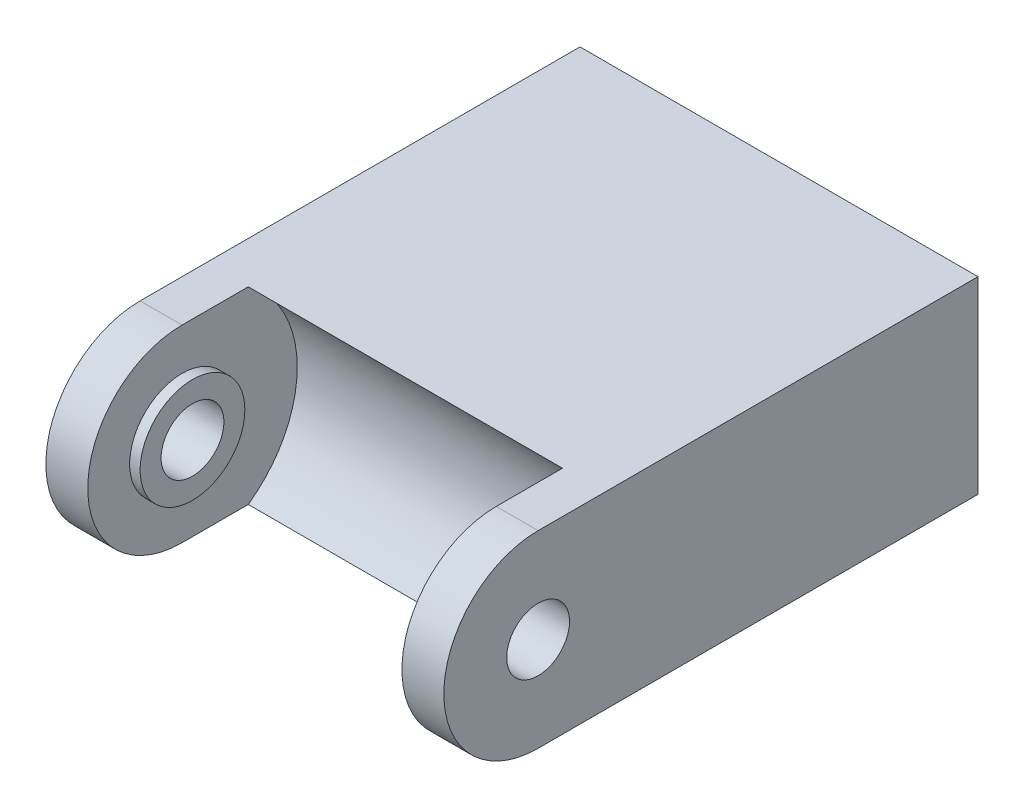
ISO-10303-21;
HEADER;
FILE_DESCRIPTION(('STEP AP214'),'2;1');
FILE_NAME('part.step','',(''),(''),'','','');
FILE_SCHEMA(('AUTOMOTIVE_DESIGN { 1 0 10303 214 1 1 1 1 }'));
ENDSEC;
DATA;
#1=APPLICATION_CONTEXT('core data for automotive mechanical design processes');
#2=APPLICATION_PROTOCOL_DEFINITION('international standard','automotive_design',2000,#1);
#3=PRODUCT_CONTEXT('',#1,'mechanical');
#4=PRODUCT('Part','Part','',(#3));
#5=PRODUCT_RELATED_PRODUCT_CATEGORY('part','',(#4));
#6=PRODUCT_DEFINITION_FORMATION('','',#4);
#7=PRODUCT_DEFINITION_CONTEXT('part definition',#1,'design');
#8=PRODUCT_DEFINITION('design','',#6,#7);
#9=PRODUCT_DEFINITION_SHAPE('','',#8);
#10=(LENGTH_UNIT() NAMED_UNIT(*) SI_UNIT(.MILLI.,.METRE.));
#11=(NAMED_UNIT(*) PLANE_ANGLE_UNIT() SI_UNIT($,.RADIAN.));
#12=(NAMED_UNIT(*) SI_UNIT($,.STERADIAN.) SOLID_ANGLE_UNIT());
#13=UNCERTAINTY_MEASURE_WITH_UNIT(LENGTH_MEASURE(1.E-05),#10,'distance_accuracy_value','');
#14=(GEOMETRIC_REPRESENTATION_CONTEXT(3) GLOBAL_UNCERTAINTY_ASSIGNED_CONTEXT((#13)) GLOBAL_UNIT_ASSIGNED_CONTEXT((#10,
#11,#12)) REPRESENTATION_CONTEXT('',''));
#15=CARTESIAN_POINT('',(0.,0.,0.));
#16=DIRECTION('',(0.,0.,1.));
#17=DIRECTION('',(1.,0.,0.));
#18=AXIS2_PLACEMENT_3D('',#15,#16,#17);
#19=CARTESIAN_POINT('',(-9.5,0.,0.));
#20=DIRECTION('',(1.,0.,0.));
#21=DIRECTION('',(0.,0.,-1.));
#22=AXIS2_PLACEMENT_3D('',#19,#20,#21);
#23=CYLINDRICAL_SURFACE('',#22,4.5);
#24=DIRECTION('',(1.,0.,0.));
#25=VECTOR('',#24,1.);
#26=CARTESIAN_POINT('',(-9.5,-4.5,0.));
#27=LINE('',#26,#25);
#28=CARTESIAN_POINT('',(-9.5,-4.5,0.));
#29=VERTEX_POINT('',#28);
#30=CARTESIAN_POINT('',(-7.5,-4.5,0.));
#31=VERTEX_POINT('',#30);
#32=EDGE_CURVE('E171',#29,#31,#27,.T.);
#33=ORIENTED_EDGE('',*,*,#32,.T.);
#34=CARTESIAN_POINT('',(-7.5,0.,0.));
#35=DIRECTION('',(1.,0.,0.));
#36=DIRECTION('',(0.,0.,-1.));
#37=AXIS2_PLACEMENT_3D('',#34,#35,#36);
#38=CIRCLE('',#37,4.5);
#39=CARTESIAN_POINT('',(-7.5,4.5,0.));
#40=VERTEX_POINT('',#39);
#41=EDGE_CURVE('E116',#31,#40,#38,.F.);
#42=ORIENTED_EDGE('',*,*,#41,.T.);
#43=DIRECTION('',(1.,0.,0.));
#44=VECTOR('',#43,1.);
#45=CARTESIAN_POINT('',(-9.5,4.5,0.));
#46=LINE('',#45,#44);
#47=CARTESIAN_POINT('',(-9.5,4.5,0.));
#48=VERTEX_POINT('',#47);
#49=EDGE_CURVE('E175',#48,#40,#46,.T.);
#50=ORIENTED_EDGE('',*,*,#49,.F.);
#51=CARTESIAN_POINT('',(-9.5,0.,0.));
#52=DIRECTION('',(1.,0.,0.));
#53=DIRECTION('',(0.,0.,-1.));
#54=AXIS2_PLACEMENT_3D('',#51,#52,#53);
#55=CIRCLE('',#54,4.5);
#56=EDGE_CURVE('E160',#48,#29,#55,.T.);
#57=ORIENTED_EDGE('',*,*,#56,.T.);
#58=EDGE_LOOP('',(#33,#42,#50,#57));
#59=FACE_BOUND('',#58,.T.);
#60=ADVANCED_FACE('F35',(#59),#23,.T.);
#61=CARTESIAN_POINT('',(-9.5,4.5,0.));
#62=DIRECTION('',(0.,-1.,0.));
#63=DIRECTION('',(0.,0.,-1.));
#64=AXIS2_PLACEMENT_3D('',#61,#62,#63);
#65=PLANE('',#64);
#66=DIRECTION('',(-1.,0.,0.));
#67=VECTOR('',#66,1.);
#68=CARTESIAN_POINT('',(7.,4.5,-3.16227766016838));
#69=LINE('',#68,#67);
#70=CARTESIAN_POINT('',(7.5,4.5,-3.16227766016838));
#71=VERTEX_POINT('',#70);
#72=CARTESIAN_POINT('',(-7.5,4.5,-3.16227766016838));
#73=VERTEX_POINT('',#72);
#74=EDGE_CURVE('E97',#71,#73,#69,.T.);
#75=ORIENTED_EDGE('',*,*,#74,.F.);
#76=DIRECTION('',(0.,0.,1.));
#77=VECTOR('',#76,1.);
#78=CARTESIAN_POINT('',(7.5,4.5,0.));
#79=LINE('',#78,#77);
#80=CARTESIAN_POINT('',(7.5,4.5,0.));
#81=VERTEX_POINT('',#80);
#82=EDGE_CURVE('E99',#71,#81,#79,.T.);
#83=ORIENTED_EDGE('',*,*,#82,.T.);
#84=CARTESIAN_POINT('',(9.5,4.5,0.));
#85=VERTEX_POINT('',#84);
#86=EDGE_CURVE('E166',#81,#85,#46,.T.);
#87=ORIENTED_EDGE('',*,*,#86,.T.);
#88=DIRECTION('',(0.,0.,-1.));
#89=VECTOR('',#88,1.);
#90=CARTESIAN_POINT('',(9.5,4.5,0.));
#91=LINE('',#90,#89);
#92=CARTESIAN_POINT('',(9.5,4.5,-21.));
#93=VERTEX_POINT('',#92);
#94=EDGE_CURVE('E107',#85,#93,#91,.T.);
#95=ORIENTED_EDGE('',*,*,#94,.T.);
#96=DIRECTION('',(1.,0.,0.));
#97=VECTOR('',#96,1.);
#98=CARTESIAN_POINT('',(-9.5,4.5,-21.));
#99=LINE('',#98,#97);
#100=CARTESIAN_POINT('',(-9.5,4.5,-21.));
#101=VERTEX_POINT('',#100);
#102=EDGE_CURVE('E167',#101,#93,#99,.T.);
#103=ORIENTED_EDGE('',*,*,#102,.F.);
#104=DIRECTION('',(0.,0.,-1.));
#105=VECTOR('',#104,1.);
#106=CARTESIAN_POINT('',(-9.5,4.5,0.));
#107=LINE('',#106,#105);
#108=EDGE_CURVE('E158',#48,#101,#107,.T.);
#109=ORIENTED_EDGE('',*,*,#108,.F.);
#110=ORIENTED_EDGE('',*,*,#49,.T.);
#111=DIRECTION('',(0.,0.,1.));
#112=VECTOR('',#111,1.);
#113=CARTESIAN_POINT('',(-7.5,4.5,0.));
#114=LINE('',#113,#112);
#115=EDGE_CURVE('E102',#73,#40,#114,.T.);
#116=ORIENTED_EDGE('',*,*,#115,.F.);
#117=EDGE_LOOP('',(#75,#83,#87,#95,#103,#109,#110,#116));
#118=FACE_BOUND('',#117,.T.);
#119=ADVANCED_FACE('F37',(#118),#65,.F.);
#120=CARTESIAN_POINT('',(-9.5,-4.5,0.));
#121=DIRECTION('',(0.,1.,0.));
#122=DIRECTION('',(0.,0.,1.));
#123=AXIS2_PLACEMENT_3D('',#120,#121,#122);
#124=PLANE('',#123);
#125=CARTESIAN_POINT('',(7.5,-4.5,0.));
#126=VERTEX_POINT('',#125);
#127=CARTESIAN_POINT('',(9.5,-4.5,0.));
#128=VERTEX_POINT('',#127);
#129=EDGE_CURVE('E174',#126,#128,#27,.T.);
#130=ORIENTED_EDGE('',*,*,#129,.F.);
#131=DIRECTION('',(0.,0.,-1.));
#132=VECTOR('',#131,1.);
#133=CARTESIAN_POINT('',(7.5,-4.5,0.));
#134=LINE('',#133,#132);
#135=CARTESIAN_POINT('',(7.5,-4.5,-3.16227766016838));
#136=VERTEX_POINT('',#135);
#137=EDGE_CURVE('E117',#126,#136,#134,.T.);
#138=ORIENTED_EDGE('',*,*,#137,.T.);
#139=DIRECTION('',(-1.,0.,0.));
#140=VECTOR('',#139,1.);
#141=CARTESIAN_POINT('',(7.,-4.5,-3.16227766016838));
#142=LINE('',#141,#140);
#143=CARTESIAN_POINT('',(-7.5,-4.5,-3.16227766016838));
#144=VERTEX_POINT('',#143);
#145=EDGE_CURVE('E120',#144,#136,#142,.F.);
#146=ORIENTED_EDGE('',*,*,#145,.F.);
#147=DIRECTION('',(0.,0.,-1.));
#148=VECTOR('',#147,1.);
#149=CARTESIAN_POINT('',(-7.5,-4.5,0.));
#150=LINE('',#149,#148);
#151=EDGE_CURVE('E11',#31,#144,#150,.T.);
#152=ORIENTED_EDGE('',*,*,#151,.F.);
#153=ORIENTED_EDGE('',*,*,#32,.F.);
#154=DIRECTION('',(0.,0.,1.));
#155=VECTOR('',#154,1.);
#156=CARTESIAN_POINT('',(-9.5,-4.5,0.));
#157=LINE('',#156,#155);
#158=CARTESIAN_POINT('',(-9.5,-4.5,-21.));
#159=VERTEX_POINT('',#158);
#160=EDGE_CURVE('E163',#159,#29,#157,.T.);
#161=ORIENTED_EDGE('',*,*,#160,.F.);
#162=DIRECTION('',(1.,0.,0.));
#163=VECTOR('',#162,1.);
#164=CARTESIAN_POINT('',(-9.5,-4.5,-21.));
#165=LINE('',#164,#163);
#166=CARTESIAN_POINT('',(9.5,-4.5,-21.));
#167=VERTEX_POINT('',#166);
#168=EDGE_CURVE('E169',#159,#167,#165,.T.);
#169=ORIENTED_EDGE('',*,*,#168,.T.);
#170=DIRECTION('',(0.,0.,1.));
#171=VECTOR('',#170,1.);
#172=CARTESIAN_POINT('',(9.5,-4.5,0.));
#173=LINE('',#172,#171);
#174=EDGE_CURVE('E152',#167,#128,#173,.T.);
#175=ORIENTED_EDGE('',*,*,#174,.T.);
#176=EDGE_LOOP('',(#130,#138,#146,#152,#153,#161,#169,#175));
#177=FACE_BOUND('',#176,.T.);
#178=ADVANCED_FACE('F227',(#177),#124,.F.);
#179=CARTESIAN_POINT('',(7.,0.,0.));
#180=DIRECTION('',(1.,0.,0.));
#181=DIRECTION('',(0.,0.,-1.));
#182=AXIS2_PLACEMENT_3D('',#179,#180,#181);
#183=PLANE('',#182);
#184=CARTESIAN_POINT('',(7.,0.,0.));
#185=DIRECTION('',(1.,0.,0.));
#186=DIRECTION('',(0.,0.,-1.));
#187=AXIS2_PLACEMENT_3D('',#184,#185,#186);
#188=CIRCLE('',#187,1.5);
#189=CARTESIAN_POINT('',(7.,0.,-1.5));
#190=VERTEX_POINT('',#189);
#191=EDGE_CURVE('E108',#190,#190,#188,.T.);
#192=ORIENTED_EDGE('',*,*,#191,.T.);
#193=EDGE_LOOP('',(#192));
#194=FACE_BOUND('',#193,.T.);
#195=CARTESIAN_POINT('',(7.,0.,0.));
#196=DIRECTION('',(1.,0.,0.));
#197=DIRECTION('',(0.,0.,-1.));
#198=AXIS2_PLACEMENT_3D('',#195,#196,#197);
#199=CIRCLE('',#198,2.5);
#200=CARTESIAN_POINT('',(7.,0.,-2.5));
#201=VERTEX_POINT('',#200);
#202=EDGE_CURVE('E125',#201,#201,#199,.F.);
#203=ORIENTED_EDGE('',*,*,#202,.T.);
#204=EDGE_LOOP('',(#203));
#205=FACE_BOUND('',#204,.T.);
#206=ADVANCED_FACE('F188',(#194,#205),#183,.F.);
#207=CARTESIAN_POINT('',(-7.,0.,0.));
#208=DIRECTION('',(1.,0.,0.));
#209=DIRECTION('',(0.,0.,-1.));
#210=AXIS2_PLACEMENT_3D('',#207,#208,#209);
#211=PLANE('',#210);
#212=CARTESIAN_POINT('',(-7.,0.,0.));
#213=DIRECTION('',(1.,0.,0.));
#214=DIRECTION('',(0.,0.,-1.));
#215=AXIS2_PLACEMENT_3D('',#212,#213,#214);
#216=CIRCLE('',#215,1.5);
#217=CARTESIAN_POINT('',(-7.,0.,-1.5));
#218=VERTEX_POINT('',#217);
#219=EDGE_CURVE('E144',#218,#218,#216,.T.);
#220=ORIENTED_EDGE('',*,*,#219,.F.);
#221=EDGE_LOOP('',(#220));
#222=FACE_BOUND('',#221,.T.);
#223=CARTESIAN_POINT('',(-7.,0.,0.));
#224=DIRECTION('',(1.,0.,0.));
#225=DIRECTION('',(0.,0.,-1.));
#226=AXIS2_PLACEMENT_3D('',#223,#224,#225);
#227=CIRCLE('',#226,2.5);
#228=CARTESIAN_POINT('',(-7.,0.,-2.5));
#229=VERTEX_POINT('',#228);
#230=EDGE_CURVE('E121',#229,#229,#227,.F.);
#231=ORIENTED_EDGE('',*,*,#230,.F.);
#232=EDGE_LOOP('',(#231));
#233=FACE_BOUND('',#232,.T.);
#234=ADVANCED_FACE('F184',(#222,#233),#211,.T.);
#235=CARTESIAN_POINT('',(-9.5,0.,-21.));
#236=DIRECTION('',(0.,0.,1.));
#237=DIRECTION('',(1.,0.,0.));
#238=AXIS2_PLACEMENT_3D('',#235,#236,#237);
#239=PLANE('',#238);
#240=CARTESIAN_POINT('',(0.,0.,-21.));
#241=DIRECTION('',(0.,0.,-1.));
#242=DIRECTION('',(-1.,0.,0.));
#243=AXIS2_PLACEMENT_3D('',#240,#241,#242);
#244=CIRCLE('',#243,1.75);
#245=CARTESIAN_POINT('',(-1.75,0.,-21.));
#246=VERTEX_POINT('',#245);
#247=EDGE_CURVE('E206',#246,#246,#244,.T.);
#248=ORIENTED_EDGE('',*,*,#247,.F.);
#249=EDGE_LOOP('',(#248));
#250=FACE_BOUND('',#249,.T.);
#251=ORIENTED_EDGE('',*,*,#102,.T.);
#252=DIRECTION('',(0.,-1.,0.));
#253=VECTOR('',#252,1.);
#254=CARTESIAN_POINT('',(9.5,0.,-21.));
#255=LINE('',#254,#253);
#256=EDGE_CURVE('E155',#93,#167,#255,.T.);
#257=ORIENTED_EDGE('',*,*,#256,.T.);
#258=ORIENTED_EDGE('',*,*,#168,.F.);
#259=DIRECTION('',(0.,-1.,0.));
#260=VECTOR('',#259,1.);
#261=CARTESIAN_POINT('',(-9.5,0.,-21.));
#262=LINE('',#261,#260);
#263=EDGE_CURVE('E50',#101,#159,#262,.T.);
#264=ORIENTED_EDGE('',*,*,#263,.F.);
#265=EDGE_LOOP('',(#251,#257,#258,#264));
#266=FACE_BOUND('',#265,.T.);
#267=ADVANCED_FACE('F187',(#250,#266),#239,.F.);
#268=CARTESIAN_POINT('',(7.5,0.,0.));
#269=DIRECTION('',(1.,0.,0.));
#270=DIRECTION('',(0.,0.,-1.));
#271=AXIS2_PLACEMENT_3D('',#268,#269,#270);
#272=CIRCLE('',#271,4.5);
#273=EDGE_CURVE('E43',#126,#81,#272,.F.);
#274=ORIENTED_EDGE('',*,*,#273,.F.);
#275=ORIENTED_EDGE('',*,*,#129,.T.);
#276=CARTESIAN_POINT('',(9.5,0.,0.));
#277=DIRECTION('',(1.,0.,0.));
#278=DIRECTION('',(0.,0.,-1.));
#279=AXIS2_PLACEMENT_3D('',#276,#277,#278);
#280=CIRCLE('',#279,4.5);
#281=EDGE_CURVE('E149',#85,#128,#280,.T.);
#282=ORIENTED_EDGE('',*,*,#281,.F.);
#283=ORIENTED_EDGE('',*,*,#86,.F.);
#284=EDGE_LOOP('',(#274,#275,#282,#283));
#285=FACE_BOUND('',#284,.T.);
#286=ADVANCED_FACE('F215',(#285),#23,.T.);
#287=CARTESIAN_POINT('',(-9.5,0.,0.));
#288=DIRECTION('',(1.,0.,0.));
#289=DIRECTION('',(0.,0.,-1.));
#290=AXIS2_PLACEMENT_3D('',#287,#288,#289);
#291=PLANE('',#290);
#292=CARTESIAN_POINT('',(-9.5,0.,0.));
#293=DIRECTION('',(1.,0.,0.));
#294=DIRECTION('',(0.,0.,-1.));
#295=AXIS2_PLACEMENT_3D('',#292,#293,#294);
#296=CIRCLE('',#295,1.5);
#297=CARTESIAN_POINT('',(-9.5,0.,-1.5));
#298=VERTEX_POINT('',#297);
#299=EDGE_CURVE('E141',#298,#298,#296,.T.);
#300=ORIENTED_EDGE('',*,*,#299,.T.);
#301=EDGE_LOOP('',(#300));
#302=FACE_BOUND('',#301,.T.);
#303=ORIENTED_EDGE('',*,*,#108,.T.);
#304=ORIENTED_EDGE('',*,*,#263,.T.);
#305=ORIENTED_EDGE('',*,*,#160,.T.);
#306=ORIENTED_EDGE('',*,*,#56,.F.);
#307=EDGE_LOOP('',(#303,#304,#305,#306));
#308=FACE_BOUND('',#307,.T.);
#309=ADVANCED_FACE('F232',(#302,#308),#291,.F.);
#310=CARTESIAN_POINT('',(9.5,0.,0.));
#311=DIRECTION('',(1.,0.,0.));
#312=DIRECTION('',(0.,0.,-1.));
#313=AXIS2_PLACEMENT_3D('',#310,#311,#312);
#314=PLANE('',#313);
#315=CARTESIAN_POINT('',(9.5,0.,0.));
#316=DIRECTION('',(1.,0.,0.));
#317=DIRECTION('',(0.,0.,-1.));
#318=AXIS2_PLACEMENT_3D('',#315,#316,#317);
#319=CIRCLE('',#318,1.5);
#320=CARTESIAN_POINT('',(9.5,0.,-1.5));
#321=VERTEX_POINT('',#320);
#322=EDGE_CURVE('E138',#321,#321,#319,.T.);
#323=ORIENTED_EDGE('',*,*,#322,.F.);
#324=EDGE_LOOP('',(#323));
#325=FACE_BOUND('',#324,.T.);
#326=ORIENTED_EDGE('',*,*,#94,.F.);
#327=ORIENTED_EDGE('',*,*,#281,.T.);
#328=ORIENTED_EDGE('',*,*,#174,.F.);
#329=ORIENTED_EDGE('',*,*,#256,.F.);
#330=EDGE_LOOP('',(#326,#327,#328,#329));
#331=FACE_BOUND('',#330,.T.);
#332=ADVANCED_FACE('F224',(#325,#331),#314,.T.);
#333=CARTESIAN_POINT('',(7.,0.,0.));
#334=DIRECTION('',(-1.,0.,0.));
#335=DIRECTION('',(0.,0.,1.));
#336=AXIS2_PLACEMENT_3D('',#333,#334,#335);
#337=CYLINDRICAL_SURFACE('',#336,5.5);
#338=ORIENTED_EDGE('',*,*,#74,.T.);
#339=CARTESIAN_POINT('',(-7.5,0.,0.));
#340=DIRECTION('',(1.,0.,0.));
#341=DIRECTION('',(0.,0.,-1.));
#342=AXIS2_PLACEMENT_3D('',#339,#340,#341);
#343=CIRCLE('',#342,5.5);
#344=EDGE_CURVE('E128',#144,#73,#343,.T.);
#345=ORIENTED_EDGE('',*,*,#344,.F.);
#346=ORIENTED_EDGE('',*,*,#145,.T.);
#347=CARTESIAN_POINT('',(7.5,0.,0.));
#348=DIRECTION('',(1.,0.,0.));
#349=DIRECTION('',(0.,0.,-1.));
#350=AXIS2_PLACEMENT_3D('',#347,#348,#349);
#351=CIRCLE('',#350,5.5);
#352=EDGE_CURVE('E113',#136,#71,#351,.T.);
#353=ORIENTED_EDGE('',*,*,#352,.T.);
#354=EDGE_LOOP('',(#338,#345,#346,#353));
#355=FACE_BOUND('',#354,.T.);
#356=ADVANCED_FACE('F119',(#355),#337,.F.);
#357=CARTESIAN_POINT('',(-9.5,0.,0.));
#358=DIRECTION('',(1.,0.,0.));
#359=DIRECTION('',(0.,0.,-1.));
#360=AXIS2_PLACEMENT_3D('',#357,#358,#359);
#361=CYLINDRICAL_SURFACE('',#360,1.5);
#362=ORIENTED_EDGE('',*,*,#219,.T.);
#363=EDGE_LOOP('',(#362));
#364=FACE_BOUND('',#363,.T.);
#365=ORIENTED_EDGE('',*,*,#299,.F.);
#366=EDGE_LOOP('',(#365));
#367=FACE_BOUND('',#366,.T.);
#368=ADVANCED_FACE('F181',(#364,#367),#361,.F.);
#369=ORIENTED_EDGE('',*,*,#322,.T.);
#370=EDGE_LOOP('',(#369));
#371=FACE_BOUND('',#370,.T.);
#372=ORIENTED_EDGE('',*,*,#191,.F.);
#373=EDGE_LOOP('',(#372));
#374=FACE_BOUND('',#373,.T.);
#375=ADVANCED_FACE('F196',(#371,#374),#361,.F.);
#376=CARTESIAN_POINT('',(7.5,0.,0.));
#377=DIRECTION('',(-1.,0.,0.));
#378=DIRECTION('',(0.,0.,1.));
#379=AXIS2_PLACEMENT_3D('',#376,#377,#378);
#380=CYLINDRICAL_SURFACE('',#379,2.5);
#381=ORIENTED_EDGE('',*,*,#230,.T.);
#382=EDGE_LOOP('',(#381));
#383=FACE_BOUND('',#382,.T.);
#384=CARTESIAN_POINT('',(-7.5,0.,0.));
#385=DIRECTION('',(1.,0.,0.));
#386=DIRECTION('',(0.,0.,-1.));
#387=AXIS2_PLACEMENT_3D('',#384,#385,#386);
#388=CIRCLE('',#387,2.5);
#389=CARTESIAN_POINT('',(-7.5,0.,-2.5));
#390=VERTEX_POINT('',#389);
#391=EDGE_CURVE('E201',#390,#390,#388,.T.);
#392=ORIENTED_EDGE('',*,*,#391,.T.);
#393=EDGE_LOOP('',(#392));
#394=FACE_BOUND('',#393,.T.);
#395=ADVANCED_FACE('F192',(#383,#394),#380,.T.);
#396=CARTESIAN_POINT('',(-7.5,0.,0.));
#397=DIRECTION('',(1.,0.,0.));
#398=DIRECTION('',(0.,0.,-1.));
#399=AXIS2_PLACEMENT_3D('',#396,#397,#398);
#400=PLANE('',#399);
#401=ORIENTED_EDGE('',*,*,#391,.F.);
#402=EDGE_LOOP('',(#401));
#403=FACE_BOUND('',#402,.T.);
#404=ORIENTED_EDGE('',*,*,#115,.T.);
#405=ORIENTED_EDGE('',*,*,#41,.F.);
#406=ORIENTED_EDGE('',*,*,#151,.T.);
#407=ORIENTED_EDGE('',*,*,#344,.T.);
#408=EDGE_LOOP('',(#404,#405,#406,#407));
#409=FACE_BOUND('',#408,.T.);
#410=ADVANCED_FACE('F195',(#403,#409),#400,.T.);
#411=CARTESIAN_POINT('',(7.5,0.,0.));
#412=DIRECTION('',(1.,0.,0.));
#413=DIRECTION('',(0.,0.,-1.));
#414=AXIS2_PLACEMENT_3D('',#411,#412,#413);
#415=PLANE('',#414);
#416=CARTESIAN_POINT('',(7.5,0.,0.));
#417=DIRECTION('',(1.,0.,0.));
#418=DIRECTION('',(0.,0.,-1.));
#419=AXIS2_PLACEMENT_3D('',#416,#417,#418);
#420=CIRCLE('',#419,2.5);
#421=CARTESIAN_POINT('',(7.5,0.,-2.5));
#422=VERTEX_POINT('',#421);
#423=EDGE_CURVE('E122',#422,#422,#420,.T.);
#424=ORIENTED_EDGE('',*,*,#423,.T.);
#425=EDGE_LOOP('',(#424));
#426=FACE_BOUND('',#425,.T.);
#427=ORIENTED_EDGE('',*,*,#352,.F.);
#428=ORIENTED_EDGE('',*,*,#137,.F.);
#429=ORIENTED_EDGE('',*,*,#273,.T.);
#430=ORIENTED_EDGE('',*,*,#82,.F.);
#431=EDGE_LOOP('',(#427,#428,#429,#430));
#432=FACE_BOUND('',#431,.T.);
#433=ADVANCED_FACE('F112',(#426,#432),#415,.F.);
#434=ORIENTED_EDGE('',*,*,#423,.F.);
#435=EDGE_LOOP('',(#434));
#436=FACE_BOUND('',#435,.T.);
#437=ORIENTED_EDGE('',*,*,#202,.F.);
#438=EDGE_LOOP('',(#437));
#439=FACE_BOUND('',#438,.T.);
#440=ADVANCED_FACE('F198',(#436,#439),#380,.T.);
#441=CARTESIAN_POINT('',(0.,0.,-19.));
#442=DIRECTION('',(0.,0.,-1.));
#443=DIRECTION('',(-1.,0.,0.));
#444=AXIS2_PLACEMENT_3D('',#441,#442,#443);
#445=CYLINDRICAL_SURFACE('',#444,1.75);
#446=CARTESIAN_POINT('',(0.,0.,-19.));
#447=DIRECTION('',(0.,0.,-1.));
#448=DIRECTION('',(-1.,0.,0.));
#449=AXIS2_PLACEMENT_3D('',#446,#447,#448);
#450=CIRCLE('',#449,1.75);
#451=CARTESIAN_POINT('',(-1.75,0.,-19.));
#452=VERTEX_POINT('',#451);
#453=EDGE_CURVE('E203',#452,#452,#450,.T.);
#454=ORIENTED_EDGE('',*,*,#453,.F.);
#455=EDGE_LOOP('',(#454));
#456=FACE_BOUND('',#455,.T.);
#457=ORIENTED_EDGE('',*,*,#247,.T.);
#458=EDGE_LOOP('',(#457));
#459=FACE_BOUND('',#458,.T.);
#460=ADVANCED_FACE('F212',(#456,#459),#445,.F.);
#461=CARTESIAN_POINT('',(0.,0.,-19.));
#462=DIRECTION('',(0.,0.,-1.));
#463=DIRECTION('',(-1.,0.,0.));
#464=AXIS2_PLACEMENT_3D('',#461,#462,#463);
#465=PLANE('',#464);
#466=ORIENTED_EDGE('',*,*,#453,.T.);
#467=EDGE_LOOP('',(#466));
#468=FACE_BOUND('',#467,.T.);
#469=ADVANCED_FACE('F270',(#468),#465,.T.);
#470=CLOSED_SHELL('',(#60,#119,#178,#206,#234,#267,#286,#309,#332,#356,#368,#375,#395,#410,#433,
#440,#460,#469));
#471=MANIFOLD_SOLID_BREP('B2',#470);
#472=ADVANCED_BREP_SHAPE_REPRESENTATION('',(#18,#471),#14);
#473=SHAPE_DEFINITION_REPRESENTATION(#9,#472);
ENDSEC;
END-ISO-10303-21;
